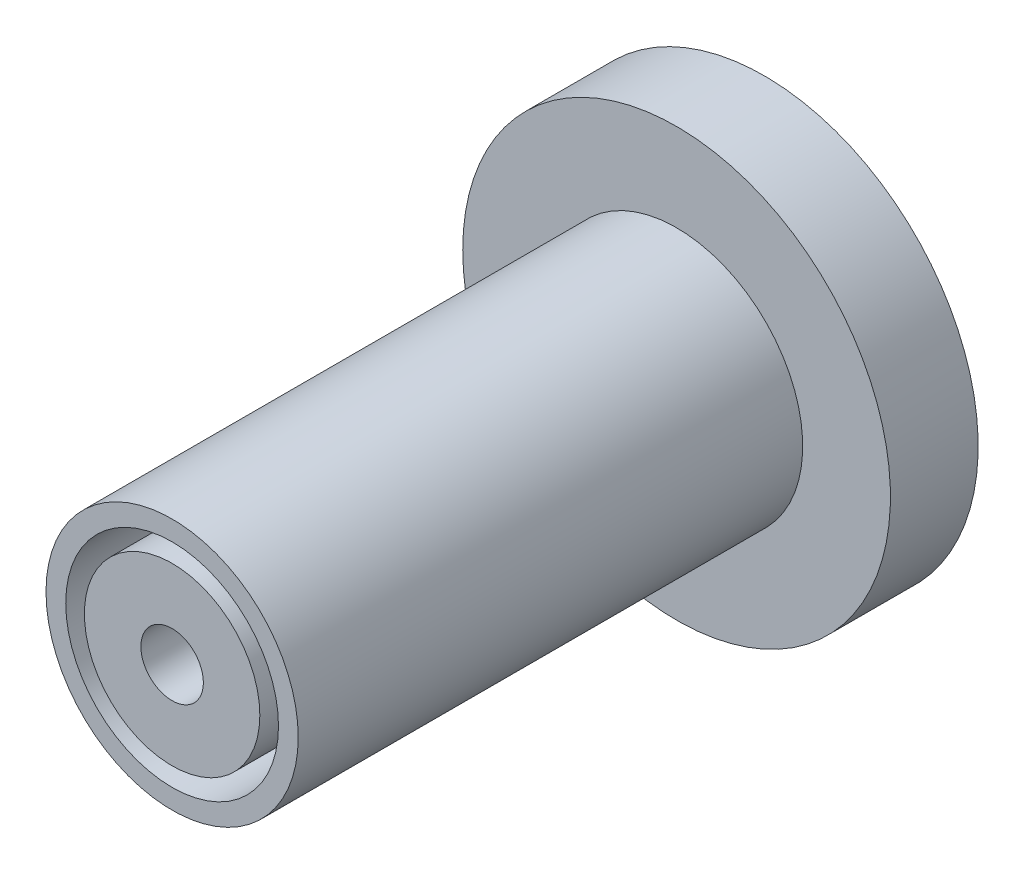
ISO-10303-21;
HEADER;
FILE_DESCRIPTION(('STEP AP214'),'2;1');
FILE_NAME('part.step','',(''),(''),'','','');
FILE_SCHEMA(('AUTOMOTIVE_DESIGN { 1 0 10303 214 1 1 1 1 }'));
ENDSEC;
DATA;
#1=APPLICATION_CONTEXT('core data for automotive mechanical design processes');
#2=APPLICATION_PROTOCOL_DEFINITION('international standard','automotive_design',2000,#1);
#3=PRODUCT_CONTEXT('',#1,'mechanical');
#4=PRODUCT('Part','Part','',(#3));
#5=PRODUCT_RELATED_PRODUCT_CATEGORY('part','',(#4));
#6=PRODUCT_DEFINITION_FORMATION('','',#4);
#7=PRODUCT_DEFINITION_CONTEXT('part definition',#1,'design');
#8=PRODUCT_DEFINITION('design','',#6,#7);
#9=PRODUCT_DEFINITION_SHAPE('','',#8);
#10=(LENGTH_UNIT() NAMED_UNIT(*) SI_UNIT(.MILLI.,.METRE.));
#11=(NAMED_UNIT(*) PLANE_ANGLE_UNIT() SI_UNIT($,.RADIAN.));
#12=(NAMED_UNIT(*) SI_UNIT($,.STERADIAN.) SOLID_ANGLE_UNIT());
#13=UNCERTAINTY_MEASURE_WITH_UNIT(LENGTH_MEASURE(1.E-05),#10,'distance_accuracy_value','');
#14=(GEOMETRIC_REPRESENTATION_CONTEXT(3) GLOBAL_UNCERTAINTY_ASSIGNED_CONTEXT((#13)) GLOBAL_UNIT_ASSIGNED_CONTEXT((#10,
#11,#12)) REPRESENTATION_CONTEXT('',''));
#15=CARTESIAN_POINT('',(0.,0.,0.));
#16=DIRECTION('',(0.,0.,1.));
#17=DIRECTION('',(1.,0.,0.));
#18=AXIS2_PLACEMENT_3D('',#15,#16,#17);
#19=CARTESIAN_POINT('',(0.,0.,6.));
#20=DIRECTION('',(0.,0.,-1.));
#21=DIRECTION('',(-1.,0.,0.));
#22=AXIS2_PLACEMENT_3D('',#19,#20,#21);
#23=CYLINDRICAL_SURFACE('',#22,4.);
#24=CARTESIAN_POINT('',(0.,0.,6.));
#25=DIRECTION('',(0.,0.,1.));
#26=DIRECTION('',(1.,0.,0.));
#27=AXIS2_PLACEMENT_3D('',#24,#25,#26);
#28=CIRCLE('',#27,4.);
#29=CARTESIAN_POINT('',(4.,0.,6.));
#30=VERTEX_POINT('',#29);
#31=EDGE_CURVE('E11',#30,#30,#28,.T.);
#32=ORIENTED_EDGE('',*,*,#31,.F.);
#33=EDGE_LOOP('',(#32));
#34=FACE_BOUND('',#33,.T.);
#35=CARTESIAN_POINT('',(0.,0.,2.8));
#36=DIRECTION('',(0.,0.,1.));
#37=DIRECTION('',(1.,0.,0.));
#38=AXIS2_PLACEMENT_3D('',#35,#36,#37);
#39=CIRCLE('',#38,4.);
#40=CARTESIAN_POINT('',(4.,0.,2.8));
#41=VERTEX_POINT('',#40);
#42=EDGE_CURVE('E50',#41,#41,#39,.T.);
#43=ORIENTED_EDGE('',*,*,#42,.T.);
#44=EDGE_LOOP('',(#43));
#45=FACE_BOUND('',#44,.T.);
#46=ADVANCED_FACE('F47',(#34,#45),#23,.T.);
#47=CARTESIAN_POINT('',(0.,0.,6.));
#48=DIRECTION('',(0.,0.,1.));
#49=DIRECTION('',(1.,0.,0.));
#50=AXIS2_PLACEMENT_3D('',#47,#48,#49);
#51=PLANE('',#50);
#52=CARTESIAN_POINT('',(0.,0.,6.));
#53=DIRECTION('',(0.,0.,1.));
#54=DIRECTION('',(1.,0.,0.));
#55=AXIS2_PLACEMENT_3D('',#52,#53,#54);
#56=CIRCLE('',#55,1.425);
#57=CARTESIAN_POINT('',(1.425,0.,6.));
#58=VERTEX_POINT('',#57);
#59=EDGE_CURVE('E59',#58,#58,#56,.T.);
#60=ORIENTED_EDGE('',*,*,#59,.F.);
#61=EDGE_LOOP('',(#60));
#62=FACE_BOUND('',#61,.T.);
#63=ORIENTED_EDGE('',*,*,#31,.T.);
#64=EDGE_LOOP('',(#63));
#65=FACE_BOUND('',#64,.T.);
#66=ADVANCED_FACE('F74',(#62,#65),#51,.T.);
#67=CARTESIAN_POINT('',(0.,0.,2.8));
#68=DIRECTION('',(0.,0.,1.));
#69=DIRECTION('',(1.,0.,0.));
#70=AXIS2_PLACEMENT_3D('',#67,#68,#69);
#71=PLANE('',#70);
#72=ORIENTED_EDGE('',*,*,#42,.F.);
#73=EDGE_LOOP('',(#72));
#74=FACE_BOUND('',#73,.T.);
#75=ADVANCED_FACE('F70',(#74),#71,.F.);
#76=CARTESIAN_POINT('',(0.,0.,3.2));
#77=DIRECTION('',(0.,0.,1.));
#78=DIRECTION('',(1.,0.,0.));
#79=AXIS2_PLACEMENT_3D('',#76,#77,#78);
#80=CYLINDRICAL_SURFACE('',#79,1.425);
#81=CARTESIAN_POINT('',(0.,0.,3.2));
#82=DIRECTION('',(0.,0.,1.));
#83=DIRECTION('',(1.,0.,0.));
#84=AXIS2_PLACEMENT_3D('',#81,#82,#83);
#85=CIRCLE('',#84,1.425);
#86=CARTESIAN_POINT('',(1.425,0.,3.2));
#87=VERTEX_POINT('',#86);
#88=EDGE_CURVE('E57',#87,#87,#85,.T.);
#89=ORIENTED_EDGE('',*,*,#88,.F.);
#90=EDGE_LOOP('',(#89));
#91=FACE_BOUND('',#90,.T.);
#92=ORIENTED_EDGE('',*,*,#59,.T.);
#93=EDGE_LOOP('',(#92));
#94=FACE_BOUND('',#93,.T.);
#95=ADVANCED_FACE('F67',(#91,#94),#80,.F.);
#96=CARTESIAN_POINT('',(0.,0.,3.2));
#97=DIRECTION('',(0.,0.,1.));
#98=DIRECTION('',(1.,0.,0.));
#99=AXIS2_PLACEMENT_3D('',#96,#97,#98);
#100=PLANE('',#99);
#101=ORIENTED_EDGE('',*,*,#88,.T.);
#102=EDGE_LOOP('',(#101));
#103=FACE_BOUND('',#102,.T.);
#104=ADVANCED_FACE('F65',(#103),#100,.T.);
#105=CLOSED_SHELL('',(#46,#66,#75,#95,#104));
#106=MANIFOLD_SOLID_BREP('B2',#105);
#107=CARTESIAN_POINT('',(0.,0.,6.));
#108=DIRECTION('',(0.,0.,-1.));
#109=DIRECTION('',(-1.,0.,0.));
#110=AXIS2_PLACEMENT_3D('',#107,#108,#109);
#111=CYLINDRICAL_SURFACE('',#110,5.75);
#112=CARTESIAN_POINT('',(0.,0.,6.));
#113=DIRECTION('',(0.,0.,1.));
#114=DIRECTION('',(1.,0.,0.));
#115=AXIS2_PLACEMENT_3D('',#112,#113,#114);
#116=CIRCLE('',#115,5.75);
#117=CARTESIAN_POINT('',(5.75,0.,6.));
#118=VERTEX_POINT('',#117);
#119=EDGE_CURVE('E126',#118,#118,#116,.T.);
#120=ORIENTED_EDGE('',*,*,#119,.F.);
#121=EDGE_LOOP('',(#120));
#122=FACE_BOUND('',#121,.T.);
#123=CARTESIAN_POINT('',(0.,0.,-17.));
#124=DIRECTION('',(0.,0.,-1.));
#125=DIRECTION('',(-1.,0.,0.));
#126=AXIS2_PLACEMENT_3D('',#123,#124,#125);
#127=CIRCLE('',#126,5.75);
#128=CARTESIAN_POINT('',(-5.75,0.,-17.));
#129=VERTEX_POINT('',#128);
#130=EDGE_CURVE('E45',#129,#129,#127,.T.);
#131=ORIENTED_EDGE('',*,*,#130,.F.);
#132=EDGE_LOOP('',(#131));
#133=FACE_BOUND('',#132,.T.);
#134=ADVANCED_FACE('F118',(#122,#133),#111,.T.);
#135=CARTESIAN_POINT('',(0.,0.,6.));
#136=DIRECTION('',(0.,0.,1.));
#137=DIRECTION('',(1.,0.,0.));
#138=AXIS2_PLACEMENT_3D('',#135,#136,#137);
#139=PLANE('',#138);
#140=CARTESIAN_POINT('',(0.,0.,6.));
#141=DIRECTION('',(0.,0.,1.));
#142=DIRECTION('',(1.,0.,0.));
#143=AXIS2_PLACEMENT_3D('',#140,#141,#142);
#144=CIRCLE('',#143,4.85);
#145=CARTESIAN_POINT('',(4.85,0.,6.));
#146=VERTEX_POINT('',#145);
#147=EDGE_CURVE('E206',#146,#146,#144,.T.);
#148=ORIENTED_EDGE('',*,*,#147,.F.);
#149=EDGE_LOOP('',(#148));
#150=FACE_BOUND('',#149,.T.);
#151=ORIENTED_EDGE('',*,*,#119,.T.);
#152=EDGE_LOOP('',(#151));
#153=FACE_BOUND('',#152,.T.);
#154=ADVANCED_FACE('F221',(#150,#153),#139,.T.);
#155=CARTESIAN_POINT('',(0.,0.,2.));
#156=DIRECTION('',(0.,0.,1.));
#157=DIRECTION('',(1.,0.,0.));
#158=AXIS2_PLACEMENT_3D('',#155,#156,#157);
#159=CYLINDRICAL_SURFACE('',#158,4.85);
#160=CARTESIAN_POINT('',(0.,0.,2.));
#161=DIRECTION('',(0.,0.,1.));
#162=DIRECTION('',(1.,0.,0.));
#163=AXIS2_PLACEMENT_3D('',#160,#161,#162);
#164=CIRCLE('',#163,4.85);
#165=CARTESIAN_POINT('',(4.85,0.,2.));
#166=VERTEX_POINT('',#165);
#167=EDGE_CURVE('E211',#166,#166,#164,.T.);
#168=ORIENTED_EDGE('',*,*,#167,.F.);
#169=EDGE_LOOP('',(#168));
#170=FACE_BOUND('',#169,.T.);
#171=ORIENTED_EDGE('',*,*,#147,.T.);
#172=EDGE_LOOP('',(#171));
#173=FACE_BOUND('',#172,.T.);
#174=ADVANCED_FACE('F250',(#170,#173),#159,.F.);
#175=CARTESIAN_POINT('',(0.,0.,2.));
#176=DIRECTION('',(0.,0.,1.));
#177=DIRECTION('',(1.,0.,0.));
#178=AXIS2_PLACEMENT_3D('',#175,#176,#177);
#179=PLANE('',#178);
#180=ORIENTED_EDGE('',*,*,#167,.T.);
#181=EDGE_LOOP('',(#180));
#182=FACE_BOUND('',#181,.T.);
#183=ADVANCED_FACE('F245',(#182),#179,.T.);
#184=CARTESIAN_POINT('',(0.,0.,-17.));
#185=DIRECTION('',(0.,0.,-1.));
#186=DIRECTION('',(-1.,0.,0.));
#187=AXIS2_PLACEMENT_3D('',#184,#185,#186);
#188=CYLINDRICAL_SURFACE('',#187,9.75);
#189=CARTESIAN_POINT('',(0.,0.,-17.));
#190=DIRECTION('',(0.,0.,-1.));
#191=DIRECTION('',(-1.,0.,0.));
#192=AXIS2_PLACEMENT_3D('',#189,#190,#191);
#193=CIRCLE('',#192,9.75);
#194=CARTESIAN_POINT('',(-9.75,0.,-17.));
#195=VERTEX_POINT('',#194);
#196=EDGE_CURVE('E196',#195,#195,#193,.T.);
#197=ORIENTED_EDGE('',*,*,#196,.T.);
#198=EDGE_LOOP('',(#197));
#199=FACE_BOUND('',#198,.T.);
#200=CARTESIAN_POINT('',(0.,0.,-21.));
#201=DIRECTION('',(0.,0.,-1.));
#202=DIRECTION('',(-1.,0.,0.));
#203=AXIS2_PLACEMENT_3D('',#200,#201,#202);
#204=CIRCLE('',#203,9.75);
#205=CARTESIAN_POINT('',(-9.75,0.,-21.));
#206=VERTEX_POINT('',#205);
#207=EDGE_CURVE('E236',#206,#206,#204,.T.);
#208=ORIENTED_EDGE('',*,*,#207,.F.);
#209=EDGE_LOOP('',(#208));
#210=FACE_BOUND('',#209,.T.);
#211=ADVANCED_FACE('F230',(#199,#210),#188,.T.);
#212=CARTESIAN_POINT('',(0.,0.,-17.));
#213=DIRECTION('',(0.,0.,-1.));
#214=DIRECTION('',(-1.,0.,0.));
#215=AXIS2_PLACEMENT_3D('',#212,#213,#214);
#216=PLANE('',#215);
#217=ORIENTED_EDGE('',*,*,#130,.T.);
#218=EDGE_LOOP('',(#217));
#219=FACE_BOUND('',#218,.T.);
#220=ORIENTED_EDGE('',*,*,#196,.F.);
#221=EDGE_LOOP('',(#220));
#222=FACE_BOUND('',#221,.T.);
#223=ADVANCED_FACE('F227',(#219,#222),#216,.F.);
#224=CARTESIAN_POINT('',(0.,0.,0.));
#225=DIRECTION('',(0.,0.,1.));
#226=DIRECTION('',(1.,0.,0.));
#227=AXIS2_PLACEMENT_3D('',#224,#225,#226);
#228=PLANE('',#227);
#229=CARTESIAN_POINT('',(0.,0.,0.));
#230=DIRECTION('',(0.,0.,-1.));
#231=DIRECTION('',(1.,0.,0.));
#232=AXIS2_PLACEMENT_3D('',#229,#230,#231);
#233=CIRCLE('',#232,3.54048886473223);
#234=CARTESIAN_POINT('',(-3.,1.88017589637058,0.));
#235=VERTEX_POINT('',#234);
#236=CARTESIAN_POINT('',(3.,1.88017589637058,0.));
#237=VERTEX_POINT('',#236);
#238=EDGE_CURVE('E184',#235,#237,#233,.T.);
#239=ORIENTED_EDGE('',*,*,#238,.T.);
#240=DIRECTION('',(0.,-1.,0.));
#241=VECTOR('',#240,1.);
#242=CARTESIAN_POINT('',(3.,1.88017589637058,0.));
#243=LINE('',#242,#241);
#244=CARTESIAN_POINT('',(3.,-1.91982410362942,0.));
#245=VERTEX_POINT('',#244);
#246=EDGE_CURVE('E165',#237,#245,#243,.T.);
#247=ORIENTED_EDGE('',*,*,#246,.T.);
#248=CARTESIAN_POINT('',(0.,0.,0.));
#249=DIRECTION('',(0.,0.,-1.));
#250=DIRECTION('',(-1.,0.,0.));
#251=AXIS2_PLACEMENT_3D('',#248,#249,#250);
#252=CIRCLE('',#251,3.56170248460992);
#253=CARTESIAN_POINT('',(-3.,-1.91982410362942,0.));
#254=VERTEX_POINT('',#253);
#255=EDGE_CURVE('E176',#245,#254,#252,.T.);
#256=ORIENTED_EDGE('',*,*,#255,.T.);
#257=DIRECTION('',(0.,1.,0.));
#258=VECTOR('',#257,1.);
#259=CARTESIAN_POINT('',(-3.,1.88017589637058,0.));
#260=LINE('',#259,#258);
#261=EDGE_CURVE('E181',#254,#235,#260,.T.);
#262=ORIENTED_EDGE('',*,*,#261,.T.);
#263=EDGE_LOOP('',(#239,#247,#256,#262));
#264=FACE_BOUND('',#263,.T.);
#265=ADVANCED_FACE('F183',(#264),#228,.F.);
#266=CARTESIAN_POINT('',(3.,1.88017589637058,0.));
#267=DIRECTION('',(1.,0.,0.));
#268=DIRECTION('',(0.,1.,0.));
#269=AXIS2_PLACEMENT_3D('',#266,#267,#268);
#270=PLANE('',#269);
#271=DIRECTION('',(0.,-1.,0.));
#272=VECTOR('',#271,1.);
#273=CARTESIAN_POINT('',(3.,1.88017589637058,-21.));
#274=LINE('',#273,#272);
#275=CARTESIAN_POINT('',(3.,1.88017589637058,-21.));
#276=VERTEX_POINT('',#275);
#277=CARTESIAN_POINT('',(3.,-1.91982410362942,-21.));
#278=VERTEX_POINT('',#277);
#279=EDGE_CURVE('E168',#276,#278,#274,.T.);
#280=ORIENTED_EDGE('',*,*,#279,.T.);
#281=DIRECTION('',(0.,0.,-1.));
#282=VECTOR('',#281,1.);
#283=CARTESIAN_POINT('',(3.,-1.91982410362942,0.));
#284=LINE('',#283,#282);
#285=EDGE_CURVE('E161',#245,#278,#284,.T.);
#286=ORIENTED_EDGE('',*,*,#285,.F.);
#287=ORIENTED_EDGE('',*,*,#246,.F.);
#288=DIRECTION('',(0.,0.,-1.));
#289=VECTOR('',#288,1.);
#290=CARTESIAN_POINT('',(3.,1.88017589637058,0.));
#291=LINE('',#290,#289);
#292=EDGE_CURVE('E156',#237,#276,#291,.T.);
#293=ORIENTED_EDGE('',*,*,#292,.T.);
#294=EDGE_LOOP('',(#280,#286,#287,#293));
#295=FACE_BOUND('',#294,.T.);
#296=ADVANCED_FACE('F163',(#295),#270,.F.);
#297=CARTESIAN_POINT('',(0.,0.,0.));
#298=DIRECTION('',(0.,0.,-1.));
#299=DIRECTION('',(-1.,0.,0.));
#300=AXIS2_PLACEMENT_3D('',#297,#298,#299);
#301=CYLINDRICAL_SURFACE('',#300,3.56170248460992);
#302=CARTESIAN_POINT('',(0.,0.,-21.));
#303=DIRECTION('',(0.,0.,-1.));
#304=DIRECTION('',(-1.,0.,0.));
#305=AXIS2_PLACEMENT_3D('',#302,#303,#304);
#306=CIRCLE('',#305,3.56170248460992);
#307=CARTESIAN_POINT('',(-3.,-1.91982410362942,-21.));
#308=VERTEX_POINT('',#307);
#309=EDGE_CURVE('E199',#278,#308,#306,.T.);
#310=ORIENTED_EDGE('',*,*,#309,.T.);
#311=DIRECTION('',(0.,0.,-1.));
#312=VECTOR('',#311,1.);
#313=CARTESIAN_POINT('',(-3.,-1.91982410362942,0.));
#314=LINE('',#313,#312);
#315=EDGE_CURVE('E173',#254,#308,#314,.T.);
#316=ORIENTED_EDGE('',*,*,#315,.F.);
#317=ORIENTED_EDGE('',*,*,#255,.F.);
#318=ORIENTED_EDGE('',*,*,#285,.T.);
#319=EDGE_LOOP('',(#310,#316,#317,#318));
#320=FACE_BOUND('',#319,.T.);
#321=ADVANCED_FACE('F177',(#320),#301,.F.);
#322=CARTESIAN_POINT('',(-3.,1.88017589637058,0.));
#323=DIRECTION('',(-1.,0.,0.));
#324=DIRECTION('',(0.,-1.,0.));
#325=AXIS2_PLACEMENT_3D('',#322,#323,#324);
#326=PLANE('',#325);
#327=DIRECTION('',(0.,1.,0.));
#328=VECTOR('',#327,1.);
#329=CARTESIAN_POINT('',(-3.,1.88017589637058,-21.));
#330=LINE('',#329,#328);
#331=CARTESIAN_POINT('',(-3.,1.88017589637058,-21.));
#332=VERTEX_POINT('',#331);
#333=EDGE_CURVE('E188',#308,#332,#330,.T.);
#334=ORIENTED_EDGE('',*,*,#333,.T.);
#335=DIRECTION('',(0.,0.,-1.));
#336=VECTOR('',#335,1.);
#337=CARTESIAN_POINT('',(-3.,1.88017589637058,0.));
#338=LINE('',#337,#336);
#339=EDGE_CURVE('E141',#235,#332,#338,.T.);
#340=ORIENTED_EDGE('',*,*,#339,.F.);
#341=ORIENTED_EDGE('',*,*,#261,.F.);
#342=ORIENTED_EDGE('',*,*,#315,.T.);
#343=EDGE_LOOP('',(#334,#340,#341,#342));
#344=FACE_BOUND('',#343,.T.);
#345=ADVANCED_FACE('F256',(#344),#326,.F.);
#346=CARTESIAN_POINT('',(0.,0.,0.));
#347=DIRECTION('',(0.,0.,-1.));
#348=DIRECTION('',(-1.,0.,0.));
#349=AXIS2_PLACEMENT_3D('',#346,#347,#348);
#350=CYLINDRICAL_SURFACE('',#349,3.54048886473223);
#351=CARTESIAN_POINT('',(0.,0.,-21.));
#352=DIRECTION('',(0.,0.,-1.));
#353=DIRECTION('',(1.,0.,0.));
#354=AXIS2_PLACEMENT_3D('',#351,#352,#353);
#355=CIRCLE('',#354,3.54048886473223);
#356=EDGE_CURVE('E133',#332,#276,#355,.T.);
#357=ORIENTED_EDGE('',*,*,#356,.T.);
#358=ORIENTED_EDGE('',*,*,#292,.F.);
#359=ORIENTED_EDGE('',*,*,#238,.F.);
#360=ORIENTED_EDGE('',*,*,#339,.T.);
#361=EDGE_LOOP('',(#357,#358,#359,#360));
#362=FACE_BOUND('',#361,.T.);
#363=ADVANCED_FACE('F259',(#362),#350,.F.);
#364=CARTESIAN_POINT('',(0.,0.,-21.));
#365=DIRECTION('',(0.,0.,-1.));
#366=DIRECTION('',(-1.,0.,0.));
#367=AXIS2_PLACEMENT_3D('',#364,#365,#366);
#368=PLANE('',#367);
#369=ORIENTED_EDGE('',*,*,#356,.F.);
#370=ORIENTED_EDGE('',*,*,#333,.F.);
#371=ORIENTED_EDGE('',*,*,#309,.F.);
#372=ORIENTED_EDGE('',*,*,#279,.F.);
#373=EDGE_LOOP('',(#369,#370,#371,#372));
#374=FACE_BOUND('',#373,.T.);
#375=ORIENTED_EDGE('',*,*,#207,.T.);
#376=EDGE_LOOP('',(#375));
#377=FACE_BOUND('',#376,.T.);
#378=ADVANCED_FACE('F242',(#374,#377),#368,.T.);
#379=CLOSED_SHELL('',(#134,#154,#174,#183,#211,#223,#265,#296,#321,#345,#363,#378));
#380=MANIFOLD_SOLID_BREP('B6',#379);
#381=ADVANCED_BREP_SHAPE_REPRESENTATION('',(#18,#106,#380),#14);
#382=SHAPE_DEFINITION_REPRESENTATION(#9,#381);
ENDSEC;
END-ISO-10303-21;
